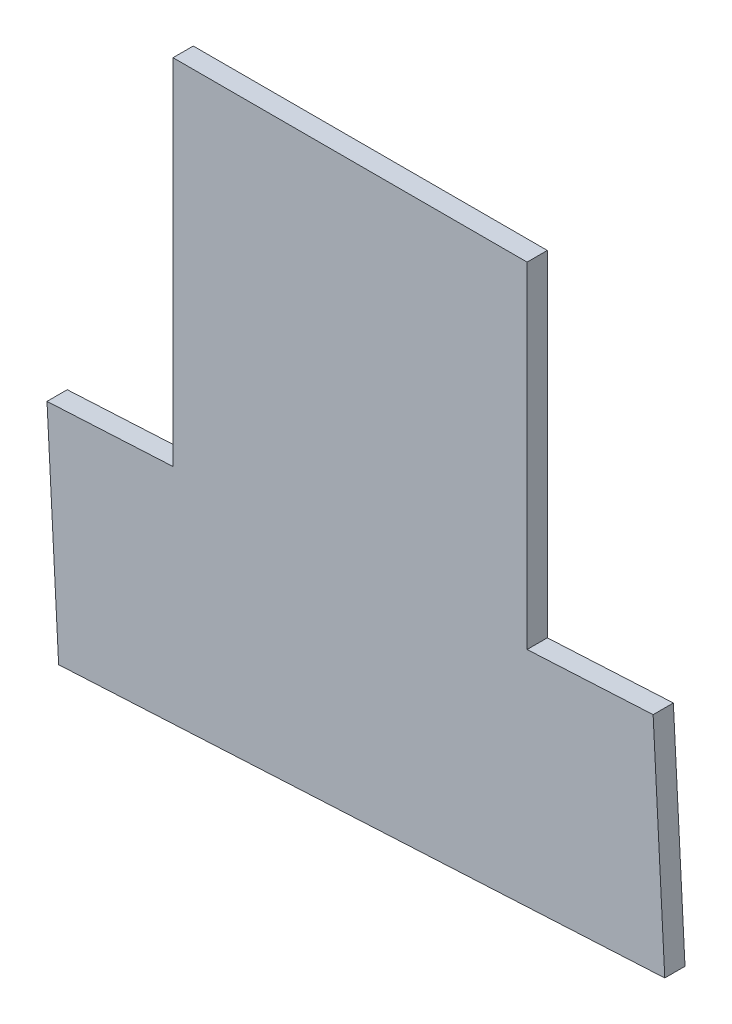
ISO-10303-21;
HEADER;
FILE_DESCRIPTION(('STEP AP214'),'2;1');
FILE_NAME('part.step','',(''),(''),'','','');
FILE_SCHEMA(('AUTOMOTIVE_DESIGN { 1 0 10303 214 1 1 1 1 }'));
ENDSEC;
DATA;
#1=APPLICATION_CONTEXT('core data for automotive mechanical design processes');
#2=APPLICATION_PROTOCOL_DEFINITION('international standard','automotive_design',2000,#1);
#3=PRODUCT_CONTEXT('',#1,'mechanical');
#4=PRODUCT('Part','Part','',(#3));
#5=PRODUCT_RELATED_PRODUCT_CATEGORY('part','',(#4));
#6=PRODUCT_DEFINITION_FORMATION('','',#4);
#7=PRODUCT_DEFINITION_CONTEXT('part definition',#1,'design');
#8=PRODUCT_DEFINITION('design','',#6,#7);
#9=PRODUCT_DEFINITION_SHAPE('','',#8);
#10=(LENGTH_UNIT() NAMED_UNIT(*) SI_UNIT(.MILLI.,.METRE.));
#11=(NAMED_UNIT(*) PLANE_ANGLE_UNIT() SI_UNIT($,.RADIAN.));
#12=(NAMED_UNIT(*) SI_UNIT($,.STERADIAN.) SOLID_ANGLE_UNIT());
#13=UNCERTAINTY_MEASURE_WITH_UNIT(LENGTH_MEASURE(1.E-05),#10,'distance_accuracy_value','');
#14=(GEOMETRIC_REPRESENTATION_CONTEXT(3) GLOBAL_UNCERTAINTY_ASSIGNED_CONTEXT((#13)) GLOBAL_UNIT_ASSIGNED_CONTEXT((#10,
#11,#12)) REPRESENTATION_CONTEXT('',''));
#15=CARTESIAN_POINT('',(0.,0.,0.));
#16=DIRECTION('',(0.,0.,1.));
#17=DIRECTION('',(1.,0.,0.));
#18=AXIS2_PLACEMENT_3D('',#15,#16,#17);
#19=CARTESIAN_POINT('',(-35.,0.,2.));
#20=DIRECTION('',(1.,0.,0.));
#21=DIRECTION('',(0.,0.,-1.));
#22=AXIS2_PLACEMENT_3D('',#19,#20,#21);
#23=PLANE('',#22);
#24=DIRECTION('',(0.,-1.,0.));
#25=VECTOR('',#24,1.);
#26=CARTESIAN_POINT('',(-35.,0.,0.));
#27=LINE('',#26,#25);
#28=CARTESIAN_POINT('',(-35.,35.,0.));
#29=VERTEX_POINT('',#28);
#30=CARTESIAN_POINT('',(-35.,0.,0.));
#31=VERTEX_POINT('',#30);
#32=EDGE_CURVE('E131',#29,#31,#27,.T.);
#33=ORIENTED_EDGE('',*,*,#32,.T.);
#34=DIRECTION('',(0.,0.,-1.));
#35=VECTOR('',#34,1.);
#36=CARTESIAN_POINT('',(-35.,0.,2.));
#37=LINE('',#36,#35);
#38=CARTESIAN_POINT('',(-35.,0.,2.));
#39=VERTEX_POINT('',#38);
#40=EDGE_CURVE('E11',#39,#31,#37,.T.);
#41=ORIENTED_EDGE('',*,*,#40,.F.);
#42=DIRECTION('',(0.,-1.,0.));
#43=VECTOR('',#42,1.);
#44=CARTESIAN_POINT('',(-35.,0.,2.));
#45=LINE('',#44,#43);
#46=CARTESIAN_POINT('',(-35.,35.,2.));
#47=VERTEX_POINT('',#46);
#48=EDGE_CURVE('E145',#47,#39,#45,.T.);
#49=ORIENTED_EDGE('',*,*,#48,.F.);
#50=DIRECTION('',(0.,0.,-1.));
#51=VECTOR('',#50,1.);
#52=CARTESIAN_POINT('',(-35.,35.,2.));
#53=LINE('',#52,#51);
#54=EDGE_CURVE('E127',#47,#29,#53,.T.);
#55=ORIENTED_EDGE('',*,*,#54,.T.);
#56=EDGE_LOOP('',(#33,#41,#49,#55));
#57=FACE_BOUND('',#56,.T.);
#58=ADVANCED_FACE('F35',(#57),#23,.F.);
#59=CARTESIAN_POINT('',(-47.4588864867513,-0.652942573110026,2.));
#60=DIRECTION('',(0.0523359562429358,-0.998629534754574,0.));
#61=DIRECTION('',(0.998629534754574,0.0523359562429358,0.));
#62=AXIS2_PLACEMENT_3D('',#59,#60,#61);
#63=PLANE('',#62);
#64=DIRECTION('',(-0.998629534754574,-0.0523359562429358,0.));
#65=VECTOR('',#64,1.);
#66=CARTESIAN_POINT('',(-47.4588864867513,-0.652942573110026,0.));
#67=LINE('',#66,#65);
#68=CARTESIAN_POINT('',(-47.4588864867513,-0.652942573110026,0.));
#69=VERTEX_POINT('',#68);
#70=EDGE_CURVE('E134',#31,#69,#67,.T.);
#71=ORIENTED_EDGE('',*,*,#70,.T.);
#72=DIRECTION('',(0.,0.,-1.));
#73=VECTOR('',#72,1.);
#74=CARTESIAN_POINT('',(-47.4588864867513,-0.652942573110026,2.));
#75=LINE('',#74,#73);
#76=CARTESIAN_POINT('',(-47.4588864867513,-0.652942573110026,2.));
#77=VERTEX_POINT('',#76);
#78=EDGE_CURVE('E43',#77,#69,#75,.T.);
#79=ORIENTED_EDGE('',*,*,#78,.F.);
#80=DIRECTION('',(-0.998629534754574,-0.0523359562429358,0.));
#81=VECTOR('',#80,1.);
#82=CARTESIAN_POINT('',(-47.4588864867513,-0.652942573110026,2.));
#83=LINE('',#82,#81);
#84=EDGE_CURVE('E94',#39,#77,#83,.T.);
#85=ORIENTED_EDGE('',*,*,#84,.F.);
#86=ORIENTED_EDGE('',*,*,#40,.T.);
#87=EDGE_LOOP('',(#71,#79,#85,#86));
#88=FACE_BOUND('',#87,.T.);
#89=ADVANCED_FACE('F180',(#88),#63,.F.);
#90=CARTESIAN_POINT('',(-46.3074945611785,-22.6227922911606,2.));
#91=DIRECTION('',(0.998629532638661,0.0523359966169432,0.));
#92=DIRECTION('',(-0.0523359966169432,0.998629532638661,0.));
#93=AXIS2_PLACEMENT_3D('',#90,#91,#92);
#94=PLANE('',#93);
#95=DIRECTION('',(0.0523359966169432,-0.998629532638661,0.));
#96=VECTOR('',#95,1.);
#97=CARTESIAN_POINT('',(-46.3074945611785,-22.6227922911606,0.));
#98=LINE('',#97,#96);
#99=CARTESIAN_POINT('',(-46.3074945611785,-22.6227922911606,0.));
#100=VERTEX_POINT('',#99);
#101=EDGE_CURVE('E136',#69,#100,#98,.T.);
#102=ORIENTED_EDGE('',*,*,#101,.T.);
#103=DIRECTION('',(0.,0.,-1.));
#104=VECTOR('',#103,1.);
#105=CARTESIAN_POINT('',(-46.3074945611785,-22.6227922911606,2.));
#106=LINE('',#105,#104);
#107=CARTESIAN_POINT('',(-46.3074945611785,-22.6227922911606,2.));
#108=VERTEX_POINT('',#107);
#109=EDGE_CURVE('E152',#108,#100,#106,.T.);
#110=ORIENTED_EDGE('',*,*,#109,.F.);
#111=DIRECTION('',(0.0523359966169432,-0.998629532638661,0.));
#112=VECTOR('',#111,1.);
#113=CARTESIAN_POINT('',(-46.3074945611785,-22.6227922911606,2.));
#114=LINE('',#113,#112);
#115=EDGE_CURVE('E160',#77,#108,#114,.T.);
#116=ORIENTED_EDGE('',*,*,#115,.F.);
#117=ORIENTED_EDGE('',*,*,#78,.T.);
#118=EDGE_LOOP('',(#102,#110,#116,#117));
#119=FACE_BOUND('',#118,.T.);
#120=ADVANCED_FACE('F158',(#119),#94,.F.);
#121=CARTESIAN_POINT('',(-46.3074945611785,-22.6227922911606,2.));
#122=DIRECTION('',(-0.0523359562429374,0.998629534754574,0.));
#123=DIRECTION('',(-0.998629534754574,-0.0523359562429374,0.));
#124=AXIS2_PLACEMENT_3D('',#121,#122,#123);
#125=PLANE('',#124);
#126=DIRECTION('',(0.998629534754574,0.0523359562429374,0.));
#127=VECTOR('',#126,1.);
#128=CARTESIAN_POINT('',(-46.3074945611785,-22.6227922911606,0.));
#129=LINE('',#128,#127);
#130=CARTESIAN_POINT('',(13.6102775240959,-19.4826349165844,0.));
#131=VERTEX_POINT('',#130);
#132=EDGE_CURVE('E138',#100,#131,#129,.T.);
#133=ORIENTED_EDGE('',*,*,#132,.T.);
#134=DIRECTION('',(0.,0.,-1.));
#135=VECTOR('',#134,1.);
#136=CARTESIAN_POINT('',(13.6102775240959,-19.4826349165844,2.));
#137=LINE('',#136,#135);
#138=CARTESIAN_POINT('',(13.6102775240959,-19.4826349165844,2.));
#139=VERTEX_POINT('',#138);
#140=EDGE_CURVE('E149',#139,#131,#137,.T.);
#141=ORIENTED_EDGE('',*,*,#140,.F.);
#142=DIRECTION('',(0.998629534754574,0.0523359562429374,0.));
#143=VECTOR('',#142,1.);
#144=CARTESIAN_POINT('',(-46.3074945611785,-22.6227922911606,2.));
#145=LINE('',#144,#143);
#146=EDGE_CURVE('E172',#108,#139,#145,.T.);
#147=ORIENTED_EDGE('',*,*,#146,.F.);
#148=ORIENTED_EDGE('',*,*,#109,.T.);
#149=EDGE_LOOP('',(#133,#141,#147,#148));
#150=FACE_BOUND('',#149,.T.);
#151=ADVANCED_FACE('F168',(#150),#125,.F.);
#152=CARTESIAN_POINT('',(13.6102775240959,-19.4826349165844,2.));
#153=DIRECTION('',(-0.998629534754574,-0.0523359562429374,0.));
#154=DIRECTION('',(0.0523359562429374,-0.998629534754574,0.));
#155=AXIS2_PLACEMENT_3D('',#152,#153,#154);
#156=PLANE('',#155);
#157=DIRECTION('',(-0.0523359562429374,0.998629534754574,0.));
#158=VECTOR('',#157,1.);
#159=CARTESIAN_POINT('',(13.6102775240959,-19.4826349165844,0.));
#160=LINE('',#159,#158);
#161=CARTESIAN_POINT('',(12.4588864867513,2.48721484801628,0.));
#162=VERTEX_POINT('',#161);
#163=EDGE_CURVE('E140',#131,#162,#160,.T.);
#164=ORIENTED_EDGE('',*,*,#163,.T.);
#165=DIRECTION('',(0.,0.,-1.));
#166=VECTOR('',#165,1.);
#167=CARTESIAN_POINT('',(12.4588864867513,2.48721484801628,2.));
#168=LINE('',#167,#166);
#169=CARTESIAN_POINT('',(12.4588864867513,2.48721484801628,2.));
#170=VERTEX_POINT('',#169);
#171=EDGE_CURVE('E122',#170,#162,#168,.T.);
#172=ORIENTED_EDGE('',*,*,#171,.F.);
#173=DIRECTION('',(-0.0523359562429374,0.998629534754574,0.));
#174=VECTOR('',#173,1.);
#175=CARTESIAN_POINT('',(13.6102775240959,-19.4826349165844,2.));
#176=LINE('',#175,#174);
#177=EDGE_CURVE('E113',#139,#170,#176,.T.);
#178=ORIENTED_EDGE('',*,*,#177,.F.);
#179=ORIENTED_EDGE('',*,*,#140,.T.);
#180=EDGE_LOOP('',(#164,#172,#178,#179));
#181=FACE_BOUND('',#180,.T.);
#182=ADVANCED_FACE('F171',(#181),#156,.F.);
#183=CARTESIAN_POINT('',(12.4588864867513,2.48721484801628,2.));
#184=DIRECTION('',(0.0523359562429373,-0.998629534754574,0.));
#185=DIRECTION('',(0.998629534754574,0.0523359562429373,0.));
#186=AXIS2_PLACEMENT_3D('',#183,#184,#185);
#187=PLANE('',#186);
#188=DIRECTION('',(-0.998629534754574,-0.0523359562429373,0.));
#189=VECTOR('',#188,1.);
#190=CARTESIAN_POINT('',(12.4588864867513,2.48721484801628,0.));
#191=LINE('',#190,#189);
#192=CARTESIAN_POINT('',(0.,1.83427227490623,0.));
#193=VERTEX_POINT('',#192);
#194=EDGE_CURVE('E121',#162,#193,#191,.T.);
#195=ORIENTED_EDGE('',*,*,#194,.T.);
#196=DIRECTION('',(0.,0.,-1.));
#197=VECTOR('',#196,1.);
#198=CARTESIAN_POINT('',(0.,1.83427227490623,2.));
#199=LINE('',#198,#197);
#200=CARTESIAN_POINT('',(0.,1.83427227490623,2.));
#201=VERTEX_POINT('',#200);
#202=EDGE_CURVE('E118',#201,#193,#199,.T.);
#203=ORIENTED_EDGE('',*,*,#202,.F.);
#204=DIRECTION('',(-0.998629534754574,-0.0523359562429373,0.));
#205=VECTOR('',#204,1.);
#206=CARTESIAN_POINT('',(12.4588864867513,2.48721484801628,2.));
#207=LINE('',#206,#205);
#208=EDGE_CURVE('E107',#170,#201,#207,.T.);
#209=ORIENTED_EDGE('',*,*,#208,.F.);
#210=ORIENTED_EDGE('',*,*,#171,.T.);
#211=EDGE_LOOP('',(#195,#203,#209,#210));
#212=FACE_BOUND('',#211,.T.);
#213=ADVANCED_FACE('F119',(#212),#187,.F.);
#214=CARTESIAN_POINT('',(0.,1.83427227490623,2.));
#215=DIRECTION('',(-1.,0.,0.));
#216=DIRECTION('',(0.,0.,1.));
#217=AXIS2_PLACEMENT_3D('',#214,#215,#216);
#218=PLANE('',#217);
#219=DIRECTION('',(0.,1.,0.));
#220=VECTOR('',#219,1.);
#221=CARTESIAN_POINT('',(0.,1.83427227490623,0.));
#222=LINE('',#221,#220);
#223=CARTESIAN_POINT('',(0.,35.,0.));
#224=VERTEX_POINT('',#223);
#225=EDGE_CURVE('E80',#193,#224,#222,.T.);
#226=ORIENTED_EDGE('',*,*,#225,.T.);
#227=DIRECTION('',(0.,0.,-1.));
#228=VECTOR('',#227,1.);
#229=CARTESIAN_POINT('',(0.,35.,2.));
#230=LINE('',#229,#228);
#231=CARTESIAN_POINT('',(0.,35.,2.));
#232=VERTEX_POINT('',#231);
#233=EDGE_CURVE('E123',#232,#224,#230,.T.);
#234=ORIENTED_EDGE('',*,*,#233,.F.);
#235=DIRECTION('',(0.,1.,0.));
#236=VECTOR('',#235,1.);
#237=CARTESIAN_POINT('',(0.,1.83427227490623,2.));
#238=LINE('',#237,#236);
#239=EDGE_CURVE('E111',#201,#232,#238,.T.);
#240=ORIENTED_EDGE('',*,*,#239,.F.);
#241=ORIENTED_EDGE('',*,*,#202,.T.);
#242=EDGE_LOOP('',(#226,#234,#240,#241));
#243=FACE_BOUND('',#242,.T.);
#244=ADVANCED_FACE('F125',(#243),#218,.F.);
#245=CARTESIAN_POINT('',(0.,35.,2.));
#246=DIRECTION('',(0.,-1.,0.));
#247=DIRECTION('',(1.,0.,0.));
#248=AXIS2_PLACEMENT_3D('',#245,#246,#247);
#249=PLANE('',#248);
#250=DIRECTION('',(-1.,0.,0.));
#251=VECTOR('',#250,1.);
#252=CARTESIAN_POINT('',(0.,35.,0.));
#253=LINE('',#252,#251);
#254=EDGE_CURVE('E86',#224,#29,#253,.T.);
#255=ORIENTED_EDGE('',*,*,#254,.T.);
#256=ORIENTED_EDGE('',*,*,#54,.F.);
#257=DIRECTION('',(-1.,0.,0.));
#258=VECTOR('',#257,1.);
#259=CARTESIAN_POINT('',(0.,35.,2.));
#260=LINE('',#259,#258);
#261=EDGE_CURVE('E51',#232,#47,#260,.T.);
#262=ORIENTED_EDGE('',*,*,#261,.F.);
#263=ORIENTED_EDGE('',*,*,#233,.T.);
#264=EDGE_LOOP('',(#255,#256,#262,#263));
#265=FACE_BOUND('',#264,.T.);
#266=ADVANCED_FACE('F196',(#265),#249,.F.);
#267=CARTESIAN_POINT('',(0.,0.,2.));
#268=DIRECTION('',(0.,0.,1.));
#269=DIRECTION('',(1.,0.,0.));
#270=AXIS2_PLACEMENT_3D('',#267,#268,#269);
#271=PLANE('',#270);
#272=ORIENTED_EDGE('',*,*,#48,.T.);
#273=ORIENTED_EDGE('',*,*,#84,.T.);
#274=ORIENTED_EDGE('',*,*,#115,.T.);
#275=ORIENTED_EDGE('',*,*,#146,.T.);
#276=ORIENTED_EDGE('',*,*,#177,.T.);
#277=ORIENTED_EDGE('',*,*,#208,.T.);
#278=ORIENTED_EDGE('',*,*,#239,.T.);
#279=ORIENTED_EDGE('',*,*,#261,.T.);
#280=EDGE_LOOP('',(#272,#273,#274,#275,#276,#277,#278,#279));
#281=FACE_BOUND('',#280,.T.);
#282=ADVANCED_FACE('F109',(#281),#271,.T.);
#283=CARTESIAN_POINT('',(0.,0.,0.));
#284=DIRECTION('',(0.,0.,1.));
#285=DIRECTION('',(1.,0.,0.));
#286=AXIS2_PLACEMENT_3D('',#283,#284,#285);
#287=PLANE('',#286);
#288=ORIENTED_EDGE('',*,*,#32,.F.);
#289=ORIENTED_EDGE('',*,*,#254,.F.);
#290=ORIENTED_EDGE('',*,*,#225,.F.);
#291=ORIENTED_EDGE('',*,*,#194,.F.);
#292=ORIENTED_EDGE('',*,*,#163,.F.);
#293=ORIENTED_EDGE('',*,*,#132,.F.);
#294=ORIENTED_EDGE('',*,*,#101,.F.);
#295=ORIENTED_EDGE('',*,*,#70,.F.);
#296=EDGE_LOOP('',(#288,#289,#290,#291,#292,#293,#294,#295));
#297=FACE_BOUND('',#296,.T.);
#298=ADVANCED_FACE('F164',(#297),#287,.F.);
#299=CLOSED_SHELL('',(#58,#89,#120,#151,#182,#213,#244,#266,#282,#298));
#300=MANIFOLD_SOLID_BREP('B2',#299);
#301=ADVANCED_BREP_SHAPE_REPRESENTATION('',(#18,#300),#14);
#302=SHAPE_DEFINITION_REPRESENTATION(#9,#301);
ENDSEC;
END-ISO-10303-21;
